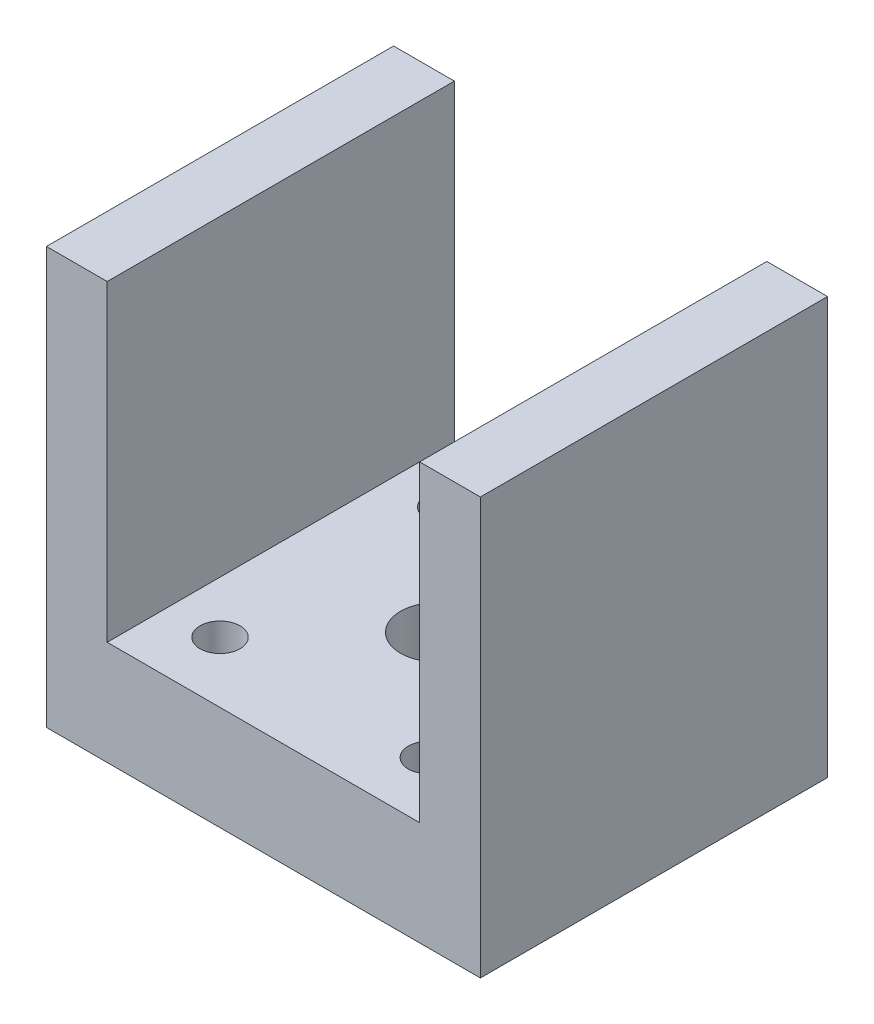
ISO-10303-21;
HEADER;
FILE_DESCRIPTION(('STEP AP214'),'2;1');
FILE_NAME('part.step','',(''),(''),'','','');
FILE_SCHEMA(('AUTOMOTIVE_DESIGN { 1 0 10303 214 1 1 1 1 }'));
ENDSEC;
DATA;
#1=APPLICATION_CONTEXT('core data for automotive mechanical design processes');
#2=APPLICATION_PROTOCOL_DEFINITION('international standard','automotive_design',2000,#1);
#3=PRODUCT_CONTEXT('',#1,'mechanical');
#4=PRODUCT('Part','Part','',(#3));
#5=PRODUCT_RELATED_PRODUCT_CATEGORY('part','',(#4));
#6=PRODUCT_DEFINITION_FORMATION('','',#4);
#7=PRODUCT_DEFINITION_CONTEXT('part definition',#1,'design');
#8=PRODUCT_DEFINITION('design','',#6,#7);
#9=PRODUCT_DEFINITION_SHAPE('','',#8);
#10=(LENGTH_UNIT() NAMED_UNIT(*) SI_UNIT(.MILLI.,.METRE.));
#11=(NAMED_UNIT(*) PLANE_ANGLE_UNIT() SI_UNIT($,.RADIAN.));
#12=(NAMED_UNIT(*) SI_UNIT($,.STERADIAN.) SOLID_ANGLE_UNIT());
#13=UNCERTAINTY_MEASURE_WITH_UNIT(LENGTH_MEASURE(1.E-05),#10,'distance_accuracy_value','');
#14=(GEOMETRIC_REPRESENTATION_CONTEXT(3) GLOBAL_UNCERTAINTY_ASSIGNED_CONTEXT((#13)) GLOBAL_UNIT_ASSIGNED_CONTEXT((#10,
#11,#12)) REPRESENTATION_CONTEXT('',''));
#15=CARTESIAN_POINT('',(0.,0.,0.));
#16=DIRECTION('',(0.,0.,1.));
#17=DIRECTION('',(1.,0.,0.));
#18=AXIS2_PLACEMENT_3D('',#15,#16,#17);
#19=CARTESIAN_POINT('',(0.,0.,0.));
#20=DIRECTION('',(0.,-1.,0.));
#21=DIRECTION('',(0.,0.,-1.));
#22=AXIS2_PLACEMENT_3D('',#19,#20,#21);
#23=CONICAL_SURFACE('',#22,2.525,0.785398163397443);
#24=CARTESIAN_POINT('',(0.,0.425,0.));
#25=DIRECTION('',(0.,-1.,0.));
#26=DIRECTION('',(0.,0.,-1.));
#27=AXIS2_PLACEMENT_3D('',#24,#25,#26);
#28=CIRCLE('',#27,2.1);
#29=CARTESIAN_POINT('',(0.,0.425,-2.1));
#30=VERTEX_POINT('',#29);
#31=EDGE_CURVE('E11',#30,#30,#28,.T.);
#32=ORIENTED_EDGE('',*,*,#31,.F.);
#33=EDGE_LOOP('',(#32));
#34=FACE_BOUND('',#33,.T.);
#35=CARTESIAN_POINT('',(0.,0.,0.));
#36=DIRECTION('',(0.,-1.,0.));
#37=DIRECTION('',(0.,0.,-1.));
#38=AXIS2_PLACEMENT_3D('',#35,#36,#37);
#39=CIRCLE('',#38,2.525);
#40=CARTESIAN_POINT('',(0.,0.,-2.525));
#41=VERTEX_POINT('',#40);
#42=EDGE_CURVE('E136',#41,#41,#39,.T.);
#43=ORIENTED_EDGE('',*,*,#42,.T.);
#44=EDGE_LOOP('',(#43));
#45=FACE_BOUND('',#44,.T.);
#46=ADVANCED_FACE('F17',(#34,#45),#23,.F.);
#47=CARTESIAN_POINT('',(0.,0.,0.));
#48=DIRECTION('',(0.,-1.,0.));
#49=DIRECTION('',(0.,0.,-1.));
#50=AXIS2_PLACEMENT_3D('',#47,#48,#49);
#51=CYLINDRICAL_SURFACE('',#50,2.1);
#52=CARTESIAN_POINT('',(0.,6.,0.));
#53=DIRECTION('',(0.,1.,0.));
#54=DIRECTION('',(0.,0.,1.));
#55=AXIS2_PLACEMENT_3D('',#52,#53,#54);
#56=CIRCLE('',#55,2.1);
#57=CARTESIAN_POINT('',(0.,6.,2.1));
#58=VERTEX_POINT('',#57);
#59=EDGE_CURVE('E111',#58,#58,#56,.T.);
#60=ORIENTED_EDGE('',*,*,#59,.T.);
#61=EDGE_LOOP('',(#60));
#62=FACE_BOUND('',#61,.T.);
#63=ORIENTED_EDGE('',*,*,#31,.T.);
#64=EDGE_LOOP('',(#63));
#65=FACE_BOUND('',#64,.T.);
#66=ADVANCED_FACE('F19',(#62,#65),#51,.F.);
#67=CARTESIAN_POINT('',(-6.,0.,6.5));
#68=DIRECTION('',(0.,-1.,0.));
#69=DIRECTION('',(0.,0.,-1.));
#70=AXIS2_PLACEMENT_3D('',#67,#68,#69);
#71=CYLINDRICAL_SURFACE('',#70,2.5);
#72=CARTESIAN_POINT('',(-6.,2.5,6.5));
#73=DIRECTION('',(0.,-1.,0.));
#74=DIRECTION('',(0.,0.,-1.));
#75=AXIS2_PLACEMENT_3D('',#72,#73,#74);
#76=CIRCLE('',#75,2.5);
#77=CARTESIAN_POINT('',(-6.,2.5,4.));
#78=VERTEX_POINT('',#77);
#79=EDGE_CURVE('E27',#78,#78,#76,.T.);
#80=ORIENTED_EDGE('',*,*,#79,.F.);
#81=EDGE_LOOP('',(#80));
#82=FACE_BOUND('',#81,.T.);
#83=CARTESIAN_POINT('',(-6.,0.,6.5));
#84=DIRECTION('',(0.,-1.,0.));
#85=DIRECTION('',(0.,0.,-1.));
#86=AXIS2_PLACEMENT_3D('',#83,#84,#85);
#87=CIRCLE('',#86,2.5);
#88=CARTESIAN_POINT('',(-6.,0.,4.));
#89=VERTEX_POINT('',#88);
#90=EDGE_CURVE('E132',#89,#89,#87,.T.);
#91=ORIENTED_EDGE('',*,*,#90,.T.);
#92=EDGE_LOOP('',(#91));
#93=FACE_BOUND('',#92,.T.);
#94=ADVANCED_FACE('F407',(#82,#93),#71,.F.);
#95=CARTESIAN_POINT('',(-4.85,2.5,6.5));
#96=DIRECTION('',(0.,1.,0.));
#97=DIRECTION('',(1.,0.,0.));
#98=AXIS2_PLACEMENT_3D('',#95,#96,#97);
#99=PLANE('',#98);
#100=CARTESIAN_POINT('',(-6.,2.5,6.5));
#101=DIRECTION('',(0.,-1.,0.));
#102=DIRECTION('',(0.,0.,-1.));
#103=AXIS2_PLACEMENT_3D('',#100,#101,#102);
#104=CIRCLE('',#103,1.15);
#105=CARTESIAN_POINT('',(-6.,2.5,5.35));
#106=VERTEX_POINT('',#105);
#107=EDGE_CURVE('E68',#106,#106,#104,.T.);
#108=ORIENTED_EDGE('',*,*,#107,.F.);
#109=EDGE_LOOP('',(#108));
#110=FACE_BOUND('',#109,.T.);
#111=ORIENTED_EDGE('',*,*,#79,.T.);
#112=EDGE_LOOP('',(#111));
#113=FACE_BOUND('',#112,.T.);
#114=ADVANCED_FACE('F418',(#110,#113),#99,.F.);
#115=CARTESIAN_POINT('',(-6.,0.,6.5));
#116=DIRECTION('',(0.,-1.,0.));
#117=DIRECTION('',(0.,0.,-1.));
#118=AXIS2_PLACEMENT_3D('',#115,#116,#117);
#119=CYLINDRICAL_SURFACE('',#118,1.15);
#120=CARTESIAN_POINT('',(-6.,6.,6.5));
#121=DIRECTION('',(0.,1.,0.));
#122=DIRECTION('',(0.,0.,1.));
#123=AXIS2_PLACEMENT_3D('',#120,#121,#122);
#124=CIRCLE('',#123,1.15);
#125=CARTESIAN_POINT('',(-6.,6.,7.65));
#126=VERTEX_POINT('',#125);
#127=EDGE_CURVE('E107',#126,#126,#124,.T.);
#128=ORIENTED_EDGE('',*,*,#127,.T.);
#129=EDGE_LOOP('',(#128));
#130=FACE_BOUND('',#129,.T.);
#131=ORIENTED_EDGE('',*,*,#107,.T.);
#132=EDGE_LOOP('',(#131));
#133=FACE_BOUND('',#132,.T.);
#134=ADVANCED_FACE('F69',(#130,#133),#119,.F.);
#135=CARTESIAN_POINT('',(6.,0.,-6.5));
#136=DIRECTION('',(0.,-1.,0.));
#137=DIRECTION('',(0.,0.,-1.));
#138=AXIS2_PLACEMENT_3D('',#135,#136,#137);
#139=CYLINDRICAL_SURFACE('',#138,2.5);
#140=CARTESIAN_POINT('',(6.,2.5,-6.5));
#141=DIRECTION('',(0.,-1.,0.));
#142=DIRECTION('',(0.,0.,-1.));
#143=AXIS2_PLACEMENT_3D('',#140,#141,#142);
#144=CIRCLE('',#143,2.5);
#145=CARTESIAN_POINT('',(6.,2.5,-9.));
#146=VERTEX_POINT('',#145);
#147=EDGE_CURVE('E72',#146,#146,#144,.T.);
#148=ORIENTED_EDGE('',*,*,#147,.F.);
#149=EDGE_LOOP('',(#148));
#150=FACE_BOUND('',#149,.T.);
#151=CARTESIAN_POINT('',(6.,0.,-6.5));
#152=DIRECTION('',(0.,-1.,0.));
#153=DIRECTION('',(0.,0.,-1.));
#154=AXIS2_PLACEMENT_3D('',#151,#152,#153);
#155=CIRCLE('',#154,2.5);
#156=CARTESIAN_POINT('',(6.,0.,-9.));
#157=VERTEX_POINT('',#156);
#158=EDGE_CURVE('E128',#157,#157,#155,.T.);
#159=ORIENTED_EDGE('',*,*,#158,.T.);
#160=EDGE_LOOP('',(#159));
#161=FACE_BOUND('',#160,.T.);
#162=ADVANCED_FACE('F437',(#150,#161),#139,.F.);
#163=CARTESIAN_POINT('',(7.15,2.5,-6.5));
#164=DIRECTION('',(0.,1.,0.));
#165=DIRECTION('',(1.,0.,0.));
#166=AXIS2_PLACEMENT_3D('',#163,#164,#165);
#167=PLANE('',#166);
#168=CARTESIAN_POINT('',(6.,2.5,-6.5));
#169=DIRECTION('',(0.,-1.,0.));
#170=DIRECTION('',(0.,0.,-1.));
#171=AXIS2_PLACEMENT_3D('',#168,#169,#170);
#172=CIRCLE('',#171,1.15);
#173=CARTESIAN_POINT('',(6.,2.5,-7.65));
#174=VERTEX_POINT('',#173);
#175=EDGE_CURVE('E79',#174,#174,#172,.T.);
#176=ORIENTED_EDGE('',*,*,#175,.F.);
#177=EDGE_LOOP('',(#176));
#178=FACE_BOUND('',#177,.T.);
#179=ORIENTED_EDGE('',*,*,#147,.T.);
#180=EDGE_LOOP('',(#179));
#181=FACE_BOUND('',#180,.T.);
#182=ADVANCED_FACE('F445',(#178,#181),#167,.F.);
#183=CARTESIAN_POINT('',(6.,0.,-6.5));
#184=DIRECTION('',(0.,-1.,0.));
#185=DIRECTION('',(0.,0.,-1.));
#186=AXIS2_PLACEMENT_3D('',#183,#184,#185);
#187=CYLINDRICAL_SURFACE('',#186,1.15);
#188=CARTESIAN_POINT('',(6.,6.,-6.5));
#189=DIRECTION('',(0.,1.,0.));
#190=DIRECTION('',(0.,0.,1.));
#191=AXIS2_PLACEMENT_3D('',#188,#189,#190);
#192=CIRCLE('',#191,1.15);
#193=CARTESIAN_POINT('',(6.,6.,-5.35));
#194=VERTEX_POINT('',#193);
#195=EDGE_CURVE('E103',#194,#194,#192,.T.);
#196=ORIENTED_EDGE('',*,*,#195,.T.);
#197=EDGE_LOOP('',(#196));
#198=FACE_BOUND('',#197,.T.);
#199=ORIENTED_EDGE('',*,*,#175,.T.);
#200=EDGE_LOOP('',(#199));
#201=FACE_BOUND('',#200,.T.);
#202=ADVANCED_FACE('F450',(#198,#201),#187,.F.);
#203=CARTESIAN_POINT('',(6.,0.,6.5));
#204=DIRECTION('',(0.,-1.,0.));
#205=DIRECTION('',(0.,0.,-1.));
#206=AXIS2_PLACEMENT_3D('',#203,#204,#205);
#207=CYLINDRICAL_SURFACE('',#206,2.5);
#208=CARTESIAN_POINT('',(6.,2.5,6.5));
#209=DIRECTION('',(0.,-1.,0.));
#210=DIRECTION('',(0.,0.,-1.));
#211=AXIS2_PLACEMENT_3D('',#208,#209,#210);
#212=CIRCLE('',#211,2.5);
#213=CARTESIAN_POINT('',(6.,2.5,4.));
#214=VERTEX_POINT('',#213);
#215=EDGE_CURVE('E82',#214,#214,#212,.T.);
#216=ORIENTED_EDGE('',*,*,#215,.F.);
#217=EDGE_LOOP('',(#216));
#218=FACE_BOUND('',#217,.T.);
#219=CARTESIAN_POINT('',(6.,0.,6.5));
#220=DIRECTION('',(0.,-1.,0.));
#221=DIRECTION('',(0.,0.,-1.));
#222=AXIS2_PLACEMENT_3D('',#219,#220,#221);
#223=CIRCLE('',#222,2.5);
#224=CARTESIAN_POINT('',(6.,0.,4.));
#225=VERTEX_POINT('',#224);
#226=EDGE_CURVE('E124',#225,#225,#223,.T.);
#227=ORIENTED_EDGE('',*,*,#226,.T.);
#228=EDGE_LOOP('',(#227));
#229=FACE_BOUND('',#228,.T.);
#230=ADVANCED_FACE('F461',(#218,#229),#207,.F.);
#231=CARTESIAN_POINT('',(7.15,2.5,6.5));
#232=DIRECTION('',(0.,1.,0.));
#233=DIRECTION('',(1.,0.,0.));
#234=AXIS2_PLACEMENT_3D('',#231,#232,#233);
#235=PLANE('',#234);
#236=CARTESIAN_POINT('',(6.,2.5,6.5));
#237=DIRECTION('',(0.,-1.,0.));
#238=DIRECTION('',(0.,0.,-1.));
#239=AXIS2_PLACEMENT_3D('',#236,#237,#238);
#240=CIRCLE('',#239,1.15);
#241=CARTESIAN_POINT('',(6.,2.5,5.35));
#242=VERTEX_POINT('',#241);
#243=EDGE_CURVE('E85',#242,#242,#240,.T.);
#244=ORIENTED_EDGE('',*,*,#243,.F.);
#245=EDGE_LOOP('',(#244));
#246=FACE_BOUND('',#245,.T.);
#247=ORIENTED_EDGE('',*,*,#215,.T.);
#248=EDGE_LOOP('',(#247));
#249=FACE_BOUND('',#248,.T.);
#250=ADVANCED_FACE('F473',(#246,#249),#235,.F.);
#251=CARTESIAN_POINT('',(6.,0.,6.5));
#252=DIRECTION('',(0.,-1.,0.));
#253=DIRECTION('',(0.,0.,-1.));
#254=AXIS2_PLACEMENT_3D('',#251,#252,#253);
#255=CYLINDRICAL_SURFACE('',#254,1.15);
#256=CARTESIAN_POINT('',(6.,6.,6.5));
#257=DIRECTION('',(0.,1.,0.));
#258=DIRECTION('',(0.,0.,1.));
#259=AXIS2_PLACEMENT_3D('',#256,#257,#258);
#260=CIRCLE('',#259,1.15);
#261=CARTESIAN_POINT('',(6.,6.,7.65));
#262=VERTEX_POINT('',#261);
#263=EDGE_CURVE('E99',#262,#262,#260,.T.);
#264=ORIENTED_EDGE('',*,*,#263,.T.);
#265=EDGE_LOOP('',(#264));
#266=FACE_BOUND('',#265,.T.);
#267=ORIENTED_EDGE('',*,*,#243,.T.);
#268=EDGE_LOOP('',(#267));
#269=FACE_BOUND('',#268,.T.);
#270=ADVANCED_FACE('F333',(#266,#269),#255,.F.);
#271=CARTESIAN_POINT('',(-6.,0.,-6.5));
#272=DIRECTION('',(0.,-1.,0.));
#273=DIRECTION('',(0.,0.,-1.));
#274=AXIS2_PLACEMENT_3D('',#271,#272,#273);
#275=CYLINDRICAL_SURFACE('',#274,2.5);
#276=CARTESIAN_POINT('',(-6.,2.5,-6.5));
#277=DIRECTION('',(0.,-1.,0.));
#278=DIRECTION('',(0.,0.,-1.));
#279=AXIS2_PLACEMENT_3D('',#276,#277,#278);
#280=CIRCLE('',#279,2.5);
#281=CARTESIAN_POINT('',(-6.,2.5,-9.));
#282=VERTEX_POINT('',#281);
#283=EDGE_CURVE('E88',#282,#282,#280,.T.);
#284=ORIENTED_EDGE('',*,*,#283,.F.);
#285=EDGE_LOOP('',(#284));
#286=FACE_BOUND('',#285,.T.);
#287=CARTESIAN_POINT('',(-6.,0.,-6.5));
#288=DIRECTION('',(0.,-1.,0.));
#289=DIRECTION('',(0.,0.,-1.));
#290=AXIS2_PLACEMENT_3D('',#287,#288,#289);
#291=CIRCLE('',#290,2.5);
#292=CARTESIAN_POINT('',(-6.,0.,-9.));
#293=VERTEX_POINT('',#292);
#294=EDGE_CURVE('E120',#293,#293,#291,.T.);
#295=ORIENTED_EDGE('',*,*,#294,.T.);
#296=EDGE_LOOP('',(#295));
#297=FACE_BOUND('',#296,.T.);
#298=ADVANCED_FACE('F327',(#286,#297),#275,.F.);
#299=CARTESIAN_POINT('',(-4.85,2.5,-6.5));
#300=DIRECTION('',(0.,1.,0.));
#301=DIRECTION('',(1.,0.,0.));
#302=AXIS2_PLACEMENT_3D('',#299,#300,#301);
#303=PLANE('',#302);
#304=CARTESIAN_POINT('',(-6.,2.5,-6.5));
#305=DIRECTION('',(0.,-1.,0.));
#306=DIRECTION('',(0.,0.,-1.));
#307=AXIS2_PLACEMENT_3D('',#304,#305,#306);
#308=CIRCLE('',#307,1.15);
#309=CARTESIAN_POINT('',(-6.,2.5,-7.65));
#310=VERTEX_POINT('',#309);
#311=EDGE_CURVE('E91',#310,#310,#308,.T.);
#312=ORIENTED_EDGE('',*,*,#311,.F.);
#313=EDGE_LOOP('',(#312));
#314=FACE_BOUND('',#313,.T.);
#315=ORIENTED_EDGE('',*,*,#283,.T.);
#316=EDGE_LOOP('',(#315));
#317=FACE_BOUND('',#316,.T.);
#318=ADVANCED_FACE('F324',(#314,#317),#303,.F.);
#319=CARTESIAN_POINT('',(-6.,0.,-6.5));
#320=DIRECTION('',(0.,-1.,0.));
#321=DIRECTION('',(0.,0.,-1.));
#322=AXIS2_PLACEMENT_3D('',#319,#320,#321);
#323=CYLINDRICAL_SURFACE('',#322,1.15);
#324=CARTESIAN_POINT('',(-6.,6.,-6.5));
#325=DIRECTION('',(0.,1.,0.));
#326=DIRECTION('',(0.,0.,1.));
#327=AXIS2_PLACEMENT_3D('',#324,#325,#326);
#328=CIRCLE('',#327,1.15);
#329=CARTESIAN_POINT('',(-6.,6.,-5.35));
#330=VERTEX_POINT('',#329);
#331=EDGE_CURVE('E95',#330,#330,#328,.T.);
#332=ORIENTED_EDGE('',*,*,#331,.T.);
#333=EDGE_LOOP('',(#332));
#334=FACE_BOUND('',#333,.T.);
#335=ORIENTED_EDGE('',*,*,#311,.T.);
#336=EDGE_LOOP('',(#335));
#337=FACE_BOUND('',#336,.T.);
#338=ADVANCED_FACE('F322',(#334,#337),#323,.F.);
#339=CARTESIAN_POINT('',(0.,6.,0.));
#340=DIRECTION('',(0.,1.,0.));
#341=DIRECTION('',(1.,0.,0.));
#342=AXIS2_PLACEMENT_3D('',#339,#340,#341);
#343=PLANE('',#342);
#344=ORIENTED_EDGE('',*,*,#331,.F.);
#345=EDGE_LOOP('',(#344));
#346=FACE_BOUND('',#345,.T.);
#347=ORIENTED_EDGE('',*,*,#263,.F.);
#348=EDGE_LOOP('',(#347));
#349=FACE_BOUND('',#348,.T.);
#350=ORIENTED_EDGE('',*,*,#195,.F.);
#351=EDGE_LOOP('',(#350));
#352=FACE_BOUND('',#351,.T.);
#353=ORIENTED_EDGE('',*,*,#127,.F.);
#354=EDGE_LOOP('',(#353));
#355=FACE_BOUND('',#354,.T.);
#356=ORIENTED_EDGE('',*,*,#59,.F.);
#357=EDGE_LOOP('',(#356));
#358=FACE_BOUND('',#357,.T.);
#359=DIRECTION('',(0.,0.,1.));
#360=VECTOR('',#359,1.);
#361=CARTESIAN_POINT('',(-9.,6.,10.));
#362=LINE('',#361,#360);
#363=CARTESIAN_POINT('',(-9.,6.,-10.));
#364=VERTEX_POINT('',#363);
#365=CARTESIAN_POINT('',(-9.,6.,10.));
#366=VERTEX_POINT('',#365);
#367=EDGE_CURVE('E116',#364,#366,#362,.T.);
#368=ORIENTED_EDGE('',*,*,#367,.T.);
#369=DIRECTION('',(1.,0.,0.));
#370=VECTOR('',#369,1.);
#371=CARTESIAN_POINT('',(9.,6.,10.));
#372=LINE('',#371,#370);
#373=CARTESIAN_POINT('',(9.,6.,10.));
#374=VERTEX_POINT('',#373);
#375=EDGE_CURVE('E154',#366,#374,#372,.T.);
#376=ORIENTED_EDGE('',*,*,#375,.T.);
#377=DIRECTION('',(0.,0.,-1.));
#378=VECTOR('',#377,1.);
#379=CARTESIAN_POINT('',(9.,6.,10.));
#380=LINE('',#379,#378);
#381=CARTESIAN_POINT('',(9.,6.,-10.));
#382=VERTEX_POINT('',#381);
#383=EDGE_CURVE('E115',#374,#382,#380,.T.);
#384=ORIENTED_EDGE('',*,*,#383,.T.);
#385=DIRECTION('',(-1.,0.,0.));
#386=VECTOR('',#385,1.);
#387=CARTESIAN_POINT('',(9.,6.,-10.));
#388=LINE('',#387,#386);
#389=EDGE_CURVE('E179',#382,#364,#388,.T.);
#390=ORIENTED_EDGE('',*,*,#389,.T.);
#391=EDGE_LOOP('',(#368,#376,#384,#390));
#392=FACE_BOUND('',#391,.T.);
#393=ADVANCED_FACE('F494',(#346,#349,#352,#355,#358,#392),#343,.T.);
#394=CARTESIAN_POINT('',(9.,6.,10.));
#395=DIRECTION('',(1.,0.,0.));
#396=DIRECTION('',(0.,1.,0.));
#397=AXIS2_PLACEMENT_3D('',#394,#395,#396);
#398=PLANE('',#397);
#399=DIRECTION('',(0.,0.,-1.));
#400=VECTOR('',#399,1.);
#401=CARTESIAN_POINT('',(9.,24.,10.));
#402=LINE('',#401,#400);
#403=CARTESIAN_POINT('',(9.,24.,10.));
#404=VERTEX_POINT('',#403);
#405=CARTESIAN_POINT('',(9.,24.,-10.));
#406=VERTEX_POINT('',#405);
#407=EDGE_CURVE('E140',#404,#406,#402,.T.);
#408=ORIENTED_EDGE('',*,*,#407,.T.);
#409=DIRECTION('',(0.,1.,0.));
#410=VECTOR('',#409,1.);
#411=CARTESIAN_POINT('',(9.,6.,-10.));
#412=LINE('',#411,#410);
#413=EDGE_CURVE('E172',#382,#406,#412,.T.);
#414=ORIENTED_EDGE('',*,*,#413,.F.);
#415=ORIENTED_EDGE('',*,*,#383,.F.);
#416=DIRECTION('',(0.,1.,0.));
#417=VECTOR('',#416,1.);
#418=CARTESIAN_POINT('',(9.,6.,10.));
#419=LINE('',#418,#417);
#420=EDGE_CURVE('E144',#374,#404,#419,.T.);
#421=ORIENTED_EDGE('',*,*,#420,.T.);
#422=EDGE_LOOP('',(#408,#414,#415,#421));
#423=FACE_BOUND('',#422,.T.);
#424=ADVANCED_FACE('F489',(#423),#398,.F.);
#425=CARTESIAN_POINT('',(-9.,6.,10.));
#426=DIRECTION('',(-1.,0.,0.));
#427=DIRECTION('',(0.,0.,1.));
#428=AXIS2_PLACEMENT_3D('',#425,#426,#427);
#429=PLANE('',#428);
#430=DIRECTION('',(0.,0.,1.));
#431=VECTOR('',#430,1.);
#432=CARTESIAN_POINT('',(-9.,24.,10.));
#433=LINE('',#432,#431);
#434=CARTESIAN_POINT('',(-9.,24.,-10.));
#435=VERTEX_POINT('',#434);
#436=CARTESIAN_POINT('',(-9.,24.,10.));
#437=VERTEX_POINT('',#436);
#438=EDGE_CURVE('E219',#435,#437,#433,.T.);
#439=ORIENTED_EDGE('',*,*,#438,.T.);
#440=DIRECTION('',(0.,1.,0.));
#441=VECTOR('',#440,1.);
#442=CARTESIAN_POINT('',(-9.,6.,10.));
#443=LINE('',#442,#441);
#444=EDGE_CURVE('E150',#366,#437,#443,.T.);
#445=ORIENTED_EDGE('',*,*,#444,.F.);
#446=ORIENTED_EDGE('',*,*,#367,.F.);
#447=DIRECTION('',(0.,1.,0.));
#448=VECTOR('',#447,1.);
#449=CARTESIAN_POINT('',(-9.,6.,-10.));
#450=LINE('',#449,#448);
#451=EDGE_CURVE('E183',#364,#435,#450,.T.);
#452=ORIENTED_EDGE('',*,*,#451,.T.);
#453=EDGE_LOOP('',(#439,#445,#446,#452));
#454=FACE_BOUND('',#453,.T.);
#455=ADVANCED_FACE('F340',(#454),#429,.F.);
#456=CARTESIAN_POINT('',(0.,0.,0.));
#457=DIRECTION('',(0.,-1.,0.));
#458=DIRECTION('',(0.,0.,-1.));
#459=AXIS2_PLACEMENT_3D('',#456,#457,#458);
#460=PLANE('',#459);
#461=ORIENTED_EDGE('',*,*,#294,.F.);
#462=EDGE_LOOP('',(#461));
#463=FACE_BOUND('',#462,.T.);
#464=ORIENTED_EDGE('',*,*,#226,.F.);
#465=EDGE_LOOP('',(#464));
#466=FACE_BOUND('',#465,.T.);
#467=ORIENTED_EDGE('',*,*,#158,.F.);
#468=EDGE_LOOP('',(#467));
#469=FACE_BOUND('',#468,.T.);
#470=ORIENTED_EDGE('',*,*,#90,.F.);
#471=EDGE_LOOP('',(#470));
#472=FACE_BOUND('',#471,.T.);
#473=ORIENTED_EDGE('',*,*,#42,.F.);
#474=EDGE_LOOP('',(#473));
#475=FACE_BOUND('',#474,.T.);
#476=DIRECTION('',(0.,0.,-1.));
#477=VECTOR('',#476,1.);
#478=CARTESIAN_POINT('',(12.5,0.,10.));
#479=LINE('',#478,#477);
#480=CARTESIAN_POINT('',(12.5,0.,10.));
#481=VERTEX_POINT('',#480);
#482=CARTESIAN_POINT('',(12.5,0.,-10.));
#483=VERTEX_POINT('',#482);
#484=EDGE_CURVE('E201',#481,#483,#479,.T.);
#485=ORIENTED_EDGE('',*,*,#484,.F.);
#486=DIRECTION('',(1.,0.,0.));
#487=VECTOR('',#486,1.);
#488=CARTESIAN_POINT('',(-12.5,0.,10.));
#489=LINE('',#488,#487);
#490=CARTESIAN_POINT('',(-12.5,0.,10.));
#491=VERTEX_POINT('',#490);
#492=EDGE_CURVE('E145',#491,#481,#489,.T.);
#493=ORIENTED_EDGE('',*,*,#492,.F.);
#494=DIRECTION('',(0.,0.,1.));
#495=VECTOR('',#494,1.);
#496=CARTESIAN_POINT('',(-12.5,0.,10.));
#497=LINE('',#496,#495);
#498=CARTESIAN_POINT('',(-12.5,0.,-10.));
#499=VERTEX_POINT('',#498);
#500=EDGE_CURVE('E162',#499,#491,#497,.T.);
#501=ORIENTED_EDGE('',*,*,#500,.F.);
#502=DIRECTION('',(-1.,0.,0.));
#503=VECTOR('',#502,1.);
#504=CARTESIAN_POINT('',(-12.5,0.,-10.));
#505=LINE('',#504,#503);
#506=EDGE_CURVE('E167',#483,#499,#505,.T.);
#507=ORIENTED_EDGE('',*,*,#506,.F.);
#508=EDGE_LOOP('',(#485,#493,#501,#507));
#509=FACE_BOUND('',#508,.T.);
#510=ADVANCED_FACE('F337',(#463,#466,#469,#472,#475,#509),#460,.T.);
#511=CARTESIAN_POINT('',(0.,24.,0.));
#512=DIRECTION('',(0.,-1.,0.));
#513=DIRECTION('',(0.,0.,-1.));
#514=AXIS2_PLACEMENT_3D('',#511,#512,#513);
#515=PLANE('',#514);
#516=DIRECTION('',(-1.,0.,0.));
#517=VECTOR('',#516,1.);
#518=CARTESIAN_POINT('',(-12.5,24.,-10.));
#519=LINE('',#518,#517);
#520=CARTESIAN_POINT('',(12.5,24.,-10.));
#521=VERTEX_POINT('',#520);
#522=EDGE_CURVE('E168',#521,#406,#519,.T.);
#523=ORIENTED_EDGE('',*,*,#522,.T.);
#524=ORIENTED_EDGE('',*,*,#407,.F.);
#525=DIRECTION('',(1.,0.,0.));
#526=VECTOR('',#525,1.);
#527=CARTESIAN_POINT('',(-12.5,24.,10.));
#528=LINE('',#527,#526);
#529=CARTESIAN_POINT('',(12.5,24.,10.));
#530=VERTEX_POINT('',#529);
#531=EDGE_CURVE('E149',#404,#530,#528,.T.);
#532=ORIENTED_EDGE('',*,*,#531,.T.);
#533=DIRECTION('',(0.,0.,-1.));
#534=VECTOR('',#533,1.);
#535=CARTESIAN_POINT('',(12.5,24.,10.));
#536=LINE('',#535,#534);
#537=EDGE_CURVE('E188',#530,#521,#536,.T.);
#538=ORIENTED_EDGE('',*,*,#537,.T.);
#539=EDGE_LOOP('',(#523,#524,#532,#538));
#540=FACE_BOUND('',#539,.T.);
#541=ADVANCED_FACE('F239',(#540),#515,.F.);
#542=CARTESIAN_POINT('',(-12.5,24.,10.));
#543=DIRECTION('',(0.,0.,-1.));
#544=DIRECTION('',(0.,-1.,0.));
#545=AXIS2_PLACEMENT_3D('',#542,#543,#544);
#546=PLANE('',#545);
#547=ORIENTED_EDGE('',*,*,#375,.F.);
#548=ORIENTED_EDGE('',*,*,#444,.T.);
#549=DIRECTION('',(1.,0.,0.));
#550=VECTOR('',#549,1.);
#551=CARTESIAN_POINT('',(-12.5,24.,10.));
#552=LINE('',#551,#550);
#553=CARTESIAN_POINT('',(-12.5,24.,10.));
#554=VERTEX_POINT('',#553);
#555=EDGE_CURVE('E226',#554,#437,#552,.T.);
#556=ORIENTED_EDGE('',*,*,#555,.F.);
#557=DIRECTION('',(0.,-1.,0.));
#558=VECTOR('',#557,1.);
#559=CARTESIAN_POINT('',(-12.5,24.,10.));
#560=LINE('',#559,#558);
#561=EDGE_CURVE('E158',#554,#491,#560,.T.);
#562=ORIENTED_EDGE('',*,*,#561,.T.);
#563=ORIENTED_EDGE('',*,*,#492,.T.);
#564=DIRECTION('',(0.,-1.,0.));
#565=VECTOR('',#564,1.);
#566=CARTESIAN_POINT('',(12.5,24.,10.));
#567=LINE('',#566,#565);
#568=EDGE_CURVE('E184',#530,#481,#567,.T.);
#569=ORIENTED_EDGE('',*,*,#568,.F.);
#570=ORIENTED_EDGE('',*,*,#531,.F.);
#571=ORIENTED_EDGE('',*,*,#420,.F.);
#572=EDGE_LOOP('',(#547,#548,#556,#562,#563,#569,#570,#571));
#573=FACE_BOUND('',#572,.T.);
#574=ADVANCED_FACE('F250',(#573),#546,.F.);
#575=CARTESIAN_POINT('',(-12.5,24.,10.));
#576=DIRECTION('',(1.,0.,0.));
#577=DIRECTION('',(0.,1.,0.));
#578=AXIS2_PLACEMENT_3D('',#575,#576,#577);
#579=PLANE('',#578);
#580=ORIENTED_EDGE('',*,*,#500,.T.);
#581=ORIENTED_EDGE('',*,*,#561,.F.);
#582=DIRECTION('',(0.,0.,1.));
#583=VECTOR('',#582,1.);
#584=CARTESIAN_POINT('',(-12.5,24.,10.));
#585=LINE('',#584,#583);
#586=CARTESIAN_POINT('',(-12.5,24.,-10.));
#587=VERTEX_POINT('',#586);
#588=EDGE_CURVE('E211',#587,#554,#585,.T.);
#589=ORIENTED_EDGE('',*,*,#588,.F.);
#590=DIRECTION('',(0.,-1.,0.));
#591=VECTOR('',#590,1.);
#592=CARTESIAN_POINT('',(-12.5,24.,-10.));
#593=LINE('',#592,#591);
#594=EDGE_CURVE('E163',#587,#499,#593,.T.);
#595=ORIENTED_EDGE('',*,*,#594,.T.);
#596=EDGE_LOOP('',(#580,#581,#589,#595));
#597=FACE_BOUND('',#596,.T.);
#598=ADVANCED_FACE('F354',(#597),#579,.F.);
#599=CARTESIAN_POINT('',(-12.5,24.,-10.));
#600=DIRECTION('',(0.,0.,1.));
#601=DIRECTION('',(1.,0.,0.));
#602=AXIS2_PLACEMENT_3D('',#599,#600,#601);
#603=PLANE('',#602);
#604=DIRECTION('',(-1.,0.,0.));
#605=VECTOR('',#604,1.);
#606=CARTESIAN_POINT('',(-12.5,24.,-10.));
#607=LINE('',#606,#605);
#608=EDGE_CURVE('E215',#435,#587,#607,.T.);
#609=ORIENTED_EDGE('',*,*,#608,.F.);
#610=ORIENTED_EDGE('',*,*,#451,.F.);
#611=ORIENTED_EDGE('',*,*,#389,.F.);
#612=ORIENTED_EDGE('',*,*,#413,.T.);
#613=ORIENTED_EDGE('',*,*,#522,.F.);
#614=DIRECTION('',(0.,-1.,0.));
#615=VECTOR('',#614,1.);
#616=CARTESIAN_POINT('',(12.5,24.,-10.));
#617=LINE('',#616,#615);
#618=EDGE_CURVE('E197',#521,#483,#617,.T.);
#619=ORIENTED_EDGE('',*,*,#618,.T.);
#620=ORIENTED_EDGE('',*,*,#506,.T.);
#621=ORIENTED_EDGE('',*,*,#594,.F.);
#622=EDGE_LOOP('',(#609,#610,#611,#612,#613,#619,#620,#621));
#623=FACE_BOUND('',#622,.T.);
#624=ADVANCED_FACE('F262',(#623),#603,.F.);
#625=CARTESIAN_POINT('',(12.5,24.,10.));
#626=DIRECTION('',(-1.,0.,0.));
#627=DIRECTION('',(0.,0.,1.));
#628=AXIS2_PLACEMENT_3D('',#625,#626,#627);
#629=PLANE('',#628);
#630=ORIENTED_EDGE('',*,*,#484,.T.);
#631=ORIENTED_EDGE('',*,*,#618,.F.);
#632=ORIENTED_EDGE('',*,*,#537,.F.);
#633=ORIENTED_EDGE('',*,*,#568,.T.);
#634=EDGE_LOOP('',(#630,#631,#632,#633));
#635=FACE_BOUND('',#634,.T.);
#636=ADVANCED_FACE('F255',(#635),#629,.F.);
#637=CARTESIAN_POINT('',(0.,24.,0.));
#638=DIRECTION('',(0.,-1.,0.));
#639=DIRECTION('',(0.,0.,-1.));
#640=AXIS2_PLACEMENT_3D('',#637,#638,#639);
#641=PLANE('',#640);
#642=ORIENTED_EDGE('',*,*,#555,.T.);
#643=ORIENTED_EDGE('',*,*,#438,.F.);
#644=ORIENTED_EDGE('',*,*,#608,.T.);
#645=ORIENTED_EDGE('',*,*,#588,.T.);
#646=EDGE_LOOP('',(#642,#643,#644,#645));
#647=FACE_BOUND('',#646,.T.);
#648=ADVANCED_FACE('F578',(#647),#641,.F.);
#649=CLOSED_SHELL('',(#46,#66,#94,#114,#134,#162,#182,#202,#230,#250,#270,#298,#318,#338,#393,
#424,#455,#510,#541,#574,#598,#624,#636,#648));
#650=MANIFOLD_SOLID_BREP('B1',#649);
#651=ADVANCED_BREP_SHAPE_REPRESENTATION('',(#18,#650),#14);
#652=SHAPE_DEFINITION_REPRESENTATION(#9,#651);
ENDSEC;
END-ISO-10303-21;
